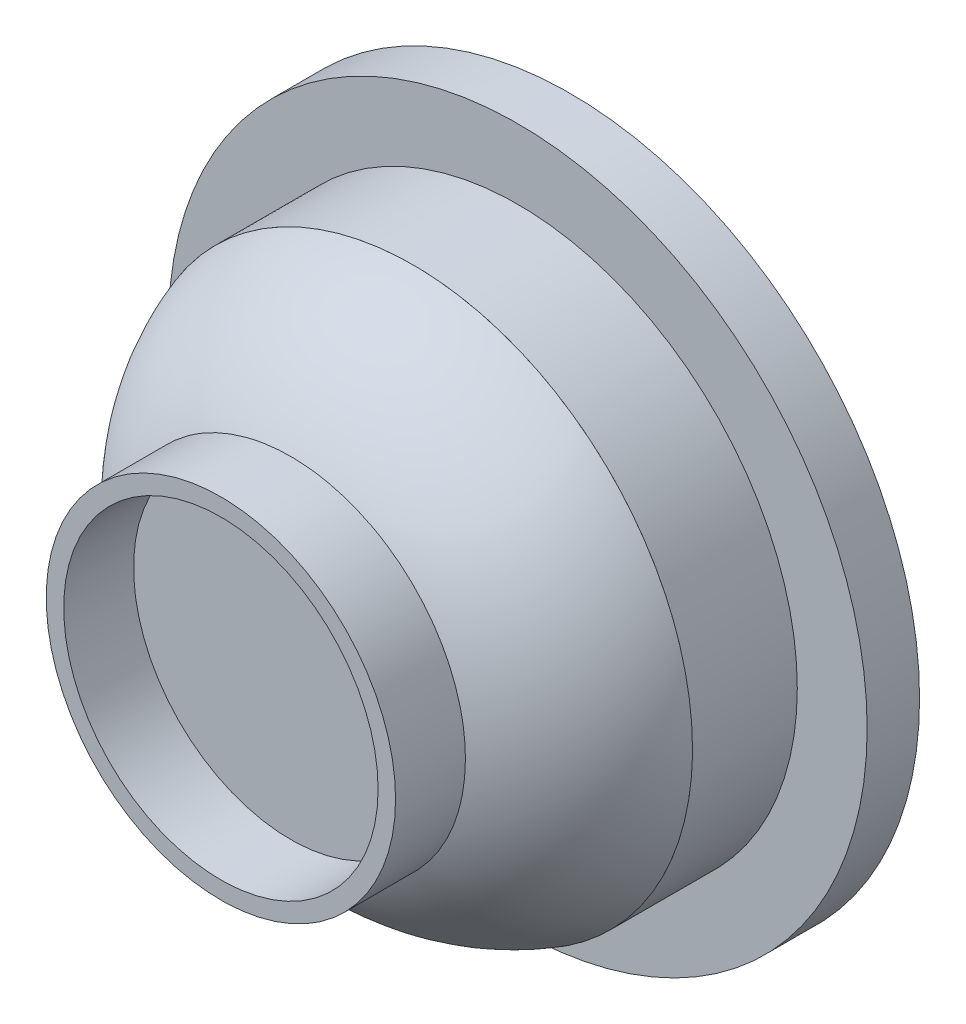
ISO-10303-21;
HEADER;
FILE_DESCRIPTION(('STEP AP214'),'2;1');
FILE_NAME('part.step','',(''),(''),'','','');
FILE_SCHEMA(('AUTOMOTIVE_DESIGN { 1 0 10303 214 1 1 1 1 }'));
ENDSEC;
DATA;
#1=APPLICATION_CONTEXT('core data for automotive mechanical design processes');
#2=APPLICATION_PROTOCOL_DEFINITION('international standard','automotive_design',2000,#1);
#3=PRODUCT_CONTEXT('',#1,'mechanical');
#4=PRODUCT('Part','Part','',(#3));
#5=PRODUCT_RELATED_PRODUCT_CATEGORY('part','',(#4));
#6=PRODUCT_DEFINITION_FORMATION('','',#4);
#7=PRODUCT_DEFINITION_CONTEXT('part definition',#1,'design');
#8=PRODUCT_DEFINITION('design','',#6,#7);
#9=PRODUCT_DEFINITION_SHAPE('','',#8);
#10=(LENGTH_UNIT() NAMED_UNIT(*) SI_UNIT(.MILLI.,.METRE.));
#11=(NAMED_UNIT(*) PLANE_ANGLE_UNIT() SI_UNIT($,.RADIAN.));
#12=(NAMED_UNIT(*) SI_UNIT($,.STERADIAN.) SOLID_ANGLE_UNIT());
#13=UNCERTAINTY_MEASURE_WITH_UNIT(LENGTH_MEASURE(1.E-05),#10,'distance_accuracy_value','');
#14=(GEOMETRIC_REPRESENTATION_CONTEXT(3) GLOBAL_UNCERTAINTY_ASSIGNED_CONTEXT((#13)) GLOBAL_UNIT_ASSIGNED_CONTEXT((#10,
#11,#12)) REPRESENTATION_CONTEXT('',''));
#15=CARTESIAN_POINT('',(0.,0.,0.));
#16=DIRECTION('',(0.,0.,1.));
#17=DIRECTION('',(1.,0.,0.));
#18=AXIS2_PLACEMENT_3D('',#15,#16,#17);
#19=CARTESIAN_POINT('',(0.,0.,45.));
#20=DIRECTION('',(0.,0.,1.));
#21=DIRECTION('',(1.,0.,0.));
#22=AXIS2_PLACEMENT_3D('',#19,#20,#21);
#23=PLANE('',#22);
#24=CARTESIAN_POINT('',(80.,0.,45.));
#25=CARTESIAN_POINT('',(80.,10.4719755119697,45.));
#26=CARTESIAN_POINT('',(77.9178141334707,20.9398307490025,45.));
#27=CARTESIAN_POINT('',(69.9029110683352,40.2895184294119,45.));
#28=CARTESIAN_POINT('',(63.9733473915511,49.1637375982602,45.));
#29=CARTESIAN_POINT('',(49.1637375982966,63.9733473915874,45.));
#30=CARTESIAN_POINT('',(40.2895184294911,69.9029110683901,45.));
#31=CARTESIAN_POINT('',(20.9398307489231,77.9178141334158,45.));
#32=CARTESIAN_POINT('',(10.4719755116933,80.,45.));
#33=CARTESIAN_POINT('',(-10.4719755116933,80.,45.));
#34=CARTESIAN_POINT('',(-20.939830749014,77.9178141332705,45.));
#35=CARTESIAN_POINT('',(-40.2895184294004,69.9029110685354,45.));
#36=CARTESIAN_POINT('',(-49.1637375982239,63.9733473916237,45.));
#37=CARTESIAN_POINT('',(-63.9733473916238,49.1637375982238,45.));
#38=CARTESIAN_POINT('',(-69.90291106839,40.2895184293641,45.));
#39=CARTESIAN_POINT('',(-77.9178141334158,20.9398307490504,45.));
#40=CARTESIAN_POINT('',(-80.,10.4719755116933,45.));
#41=CARTESIAN_POINT('',(-80.,-10.4719755116933,45.));
#42=CARTESIAN_POINT('',(-77.9178141334158,-20.9398307489957,45.));
#43=CARTESIAN_POINT('',(-69.9029110683901,-40.2895184294184,45.));
#44=CARTESIAN_POINT('',(-63.9733473916963,-49.1637375981149,45.));
#45=CARTESIAN_POINT('',(-49.1637375981512,-63.9733473917327,45.));
#46=CARTESIAN_POINT('',(-40.2895184293656,-69.9029110684597,45.));
#47=CARTESIAN_POINT('',(-20.939830749049,-77.917814133346,45.));
#48=CARTESIAN_POINT('',(-10.4719755116932,-79.9999999999274,45.));
#49=CARTESIAN_POINT('',(10.4719755116934,-80.0000000000727,45.));
#50=CARTESIAN_POINT('',(20.9398307490488,-77.9178141333461,45.));
#51=CARTESIAN_POINT('',(40.2895184293653,-69.9029110684598,45.));
#52=CARTESIAN_POINT('',(49.1637375984142,-63.9733473914335,45.));
#53=CARTESIAN_POINT('',(63.9733473914331,-49.1637375984145,45.));
#54=CARTESIAN_POINT('',(69.9029110683144,-40.2895184294201,45.));
#55=CARTESIAN_POINT('',(77.9178141334914,-20.9398307489945,45.));
#56=CARTESIAN_POINT('',(80.,-10.4719755119697,45.));
#57=CARTESIAN_POINT('',(80.,0.,45.));
#58=(BOUNDED_CURVE() B_SPLINE_CURVE(3,(#24,#25,#26,#27,#28,#29,#30,#31,#32,#33,#34,#35,#36,#37,
#38,#39,#40,#41,#42,#43,#44,#45,#46,#47,#48,#49,#50,#51,#52,#53,#54,#55,#56,#57),.UNSPECIFIED.,
.T.,.F.) B_SPLINE_CURVE_WITH_KNOTS((4,2,2,2,2,2,2,2,2,2,2,2,2,2,2,2,4),(0.,0.392699081698724,
0.785398163397448,1.17809724509617,1.5707963267949,1.96349540849362,2.35619449019234,
2.74889357189107,3.14159265358979,3.53429173528852,3.92699081698724,4.31968989868597,
4.71238898038469,5.10508806208341,5.49778714378214,5.89048622548086,6.28318530717959),
.UNSPECIFIED.) CURVE() GEOMETRIC_REPRESENTATION_ITEM() RATIONAL_B_SPLINE_CURVE((1.,1.,1.,1.,1.,
1.,1.,1.,1.,1.,1.,1.,1.,1.,1.,1.,1.,1.,1.,1.,1.,1.,1.,1.,1.,1.,1.,1.,1.,1.,1.,1.,1.,1.)) REPRESENTATION_ITEM(''));
#59=CARTESIAN_POINT('',(80.,0.,45.));
#60=VERTEX_POINT('',#59);
#61=EDGE_CURVE('E69',#60,#60,#58,.T.);
#62=ORIENTED_EDGE('',*,*,#61,.F.);
#63=EDGE_LOOP('',(#62));
#64=FACE_BOUND('',#63,.T.);
#65=ADVANCED_FACE('F56',(#64),#23,.F.);
#66=CARTESIAN_POINT('',(0.,0.,100.));
#67=DIRECTION('',(0.,0.,1.));
#68=DIRECTION('',(1.,0.,0.));
#69=AXIS2_PLACEMENT_3D('',#66,#67,#68);
#70=PLANE('',#69);
#71=CARTESIAN_POINT('',(0.,0.,100.));
#72=DIRECTION('',(0.,0.,1.));
#73=DIRECTION('',(1.,0.,0.));
#74=AXIS2_PLACEMENT_3D('',#71,#72,#73);
#75=CIRCLE('',#74,50.);
#76=CARTESIAN_POINT('',(50.,0.,100.));
#77=VERTEX_POINT('',#76);
#78=EDGE_CURVE('E74',#77,#77,#75,.T.);
#79=ORIENTED_EDGE('',*,*,#78,.T.);
#80=EDGE_LOOP('',(#79));
#81=FACE_BOUND('',#80,.T.);
#82=CARTESIAN_POINT('',(0.,0.,100.));
#83=DIRECTION('',(0.,0.,1.));
#84=DIRECTION('',(1.,0.,0.));
#85=AXIS2_PLACEMENT_3D('',#82,#83,#84);
#86=CIRCLE('',#85,45.);
#87=CARTESIAN_POINT('',(45.,0.,100.));
#88=VERTEX_POINT('',#87);
#89=EDGE_CURVE('E139',#88,#88,#86,.T.);
#90=ORIENTED_EDGE('',*,*,#89,.F.);
#91=EDGE_LOOP('',(#90));
#92=FACE_BOUND('',#91,.T.);
#93=ADVANCED_FACE('F118',(#81,#92),#70,.T.);
#94=CARTESIAN_POINT('',(0.,0.,100.));
#95=DIRECTION('',(0.,0.,-1.));
#96=DIRECTION('',(-1.,0.,0.));
#97=AXIS2_PLACEMENT_3D('',#94,#95,#96);
#98=CYLINDRICAL_SURFACE('',#97,50.);
#99=ORIENTED_EDGE('',*,*,#78,.F.);
#100=EDGE_LOOP('',(#99));
#101=FACE_BOUND('',#100,.T.);
#102=CARTESIAN_POINT('',(50.,0.,80.));
#103=CARTESIAN_POINT('',(50.,-6.54498469498106,80.));
#104=CARTESIAN_POINT('',(48.6986338333685,-13.0873942180966,80.0000000001453));
#105=CARTESIAN_POINT('',(43.6893194177601,-25.1809490184125,79.9999999998547));
#106=CARTESIAN_POINT('',(39.9833421196639,-30.7273359989909,80.0000000001453));
#107=CARTESIAN_POINT('',(30.7273359989907,-39.9833421196641,79.9999999998547));
#108=CARTESIAN_POINT('',(25.1809490183579,-43.6893194178328,80.));
#109=CARTESIAN_POINT('',(13.0873942181509,-48.6986338332959,80.));
#110=CARTESIAN_POINT('',(6.54498469480838,-49.9999999999637,79.9999999999273));
#111=CARTESIAN_POINT('',(-6.54498469480822,-50.0000000000363,80.0000000000726));
#112=CARTESIAN_POINT('',(-13.0873942181511,-48.6986338334049,80.));
#113=CARTESIAN_POINT('',(-25.180949018358,-43.6893194177238,80.));
#114=CARTESIAN_POINT('',(-30.727335998899,-39.9833421197921,80.));
#115=CARTESIAN_POINT('',(-39.9833421197557,-30.7273359988627,80.));
#116=CARTESIAN_POINT('',(-43.6893194177075,-25.1809490184092,80.));
#117=CARTESIAN_POINT('',(-48.6986338334212,-13.0873942180996,80.));
#118=CARTESIAN_POINT('',(-50.,-6.54498469480829,80.));
#119=CARTESIAN_POINT('',(-50.,6.5449846948083,80.));
#120=CARTESIAN_POINT('',(-48.6986338333485,13.0873942181361,80.));
#121=CARTESIAN_POINT('',(-43.6893194177801,25.180949018373,80.));
#122=CARTESIAN_POINT('',(-39.9833421197558,30.727335998899,79.9999999999273));
#123=CARTESIAN_POINT('',(-30.727335998899,39.9833421197557,80.0000000000727));
#124=CARTESIAN_POINT('',(-25.1809490184093,43.6893194178165,80.));
#125=CARTESIAN_POINT('',(-13.0873942180997,48.6986338333122,80.));
#126=CARTESIAN_POINT('',(-6.54498469480829,50.,80.));
#127=CARTESIAN_POINT('',(6.54498469480829,50.,80.));
#128=CARTESIAN_POINT('',(13.0873942180633,48.6986338333486,80.0000000001453));
#129=CARTESIAN_POINT('',(25.1809490184456,43.6893194177801,79.9999999998547));
#130=CARTESIAN_POINT('',(30.7273359988627,39.9833421197557,80.0000000000726));
#131=CARTESIAN_POINT('',(39.9833421197921,30.727335998899,79.9999999999273));
#132=CARTESIAN_POINT('',(43.6893194177913,25.1809490184188,79.9999999999274));
#133=CARTESIAN_POINT('',(48.6986338333374,13.0873942180902,80.0000000000727));
#134=CARTESIAN_POINT('',(50.,6.54498469498105,80.));
#135=CARTESIAN_POINT('',(50.,0.,80.));
#136=(BOUNDED_CURVE() B_SPLINE_CURVE(3,(#102,#103,#104,#105,#106,#107,#108,#109,#110,#111,#112,
#113,#114,#115,#116,#117,#118,#119,#120,#121,#122,#123,#124,#125,#126,#127,#128,#129,#130,#131,
#132,#133,#134,#135),.UNSPECIFIED.,.T.,.F.) B_SPLINE_CURVE_WITH_KNOTS((4,2,2,2,2,2,2,2,2,2,2,2,
2,2,2,2,4),(0.,0.392699081698725,0.785398163397448,1.17809724509617,1.5707963267949,
1.96349540849362,2.35619449019234,2.74889357189107,3.14159265358979,3.53429173528852,
3.92699081698724,4.31968989868597,4.71238898038469,5.10508806208341,5.49778714378214,
5.89048622548086,6.28318530717959),
.UNSPECIFIED.) CURVE() GEOMETRIC_REPRESENTATION_ITEM() RATIONAL_B_SPLINE_CURVE((1.,1.,1.,1.,1.,
1.,1.,1.,1.,1.,1.,1.,1.,1.,1.,1.,1.,1.,1.,1.,1.,1.,1.,1.,1.,1.,1.,1.,1.,1.,1.,1.,1.,1.)) REPRESENTATION_ITEM(''));
#137=CARTESIAN_POINT('',(50.,0.,80.));
#138=VERTEX_POINT('',#137);
#139=EDGE_CURVE('E82',#138,#138,#136,.F.);
#140=ORIENTED_EDGE('',*,*,#139,.T.);
#141=EDGE_LOOP('',(#140));
#142=FACE_BOUND('',#141,.T.);
#143=ADVANCED_FACE('F107',(#101,#142),#98,.T.);
#144=CARTESIAN_POINT('',(0.,0.,100.));
#145=DIRECTION('',(0.,0.,-1.));
#146=DIRECTION('',(-1.,0.,0.));
#147=AXIS2_PLACEMENT_3D('',#144,#145,#146);
#148=CYLINDRICAL_SURFACE('',#147,45.);
#149=ORIENTED_EDGE('',*,*,#89,.T.);
#150=EDGE_LOOP('',(#149));
#151=FACE_BOUND('',#150,.T.);
#152=CARTESIAN_POINT('',(0.,0.,80.));
#153=DIRECTION('',(0.,0.,1.));
#154=DIRECTION('',(1.,0.,0.));
#155=AXIS2_PLACEMENT_3D('',#152,#153,#154);
#156=CIRCLE('',#155,45.);
#157=CARTESIAN_POINT('',(45.,0.,80.));
#158=VERTEX_POINT('',#157);
#159=EDGE_CURVE('E12',#158,#158,#156,.F.);
#160=ORIENTED_EDGE('',*,*,#159,.T.);
#161=EDGE_LOOP('',(#160));
#162=FACE_BOUND('',#161,.T.);
#163=ADVANCED_FACE('F117',(#151,#162),#148,.F.);
#164=CARTESIAN_POINT('',(0.,0.,80.));
#165=DIRECTION('',(0.,0.,1.));
#166=DIRECTION('',(1.,0.,0.));
#167=AXIS2_PLACEMENT_3D('',#164,#165,#166);
#168=PLANE('',#167);
#169=ORIENTED_EDGE('',*,*,#159,.F.);
#170=EDGE_LOOP('',(#169));
#171=FACE_BOUND('',#170,.T.);
#172=ADVANCED_FACE('F121',(#171),#168,.T.);
#173=CARTESIAN_POINT('',(50.,0.,80.));
#174=CARTESIAN_POINT('',(50.,6.54498469498105,80.));
#175=CARTESIAN_POINT('',(48.6986338333374,13.0873942180902,80.0000000000727));
#176=CARTESIAN_POINT('',(43.6893194177913,25.1809490184188,79.9999999999274));
#177=CARTESIAN_POINT('',(39.9833421197921,30.727335998899,79.9999999999273));
#178=CARTESIAN_POINT('',(30.7273359988627,39.9833421197557,80.0000000000726));
#179=CARTESIAN_POINT('',(25.1809490184456,43.6893194177801,79.9999999998547));
#180=CARTESIAN_POINT('',(13.0873942180633,48.6986338333486,80.0000000001453));
#181=CARTESIAN_POINT('',(6.54498469480829,50.,80.));
#182=CARTESIAN_POINT('',(-6.54498469480829,50.,80.));
#183=CARTESIAN_POINT('',(-13.0873942180997,48.6986338333122,80.));
#184=CARTESIAN_POINT('',(-25.1809490184093,43.6893194178165,80.));
#185=CARTESIAN_POINT('',(-30.727335998899,39.9833421197557,80.0000000000727));
#186=CARTESIAN_POINT('',(-39.9833421197558,30.727335998899,79.9999999999273));
#187=CARTESIAN_POINT('',(-43.6893194177801,25.180949018373,80.));
#188=CARTESIAN_POINT('',(-48.6986338333485,13.0873942181361,80.));
#189=CARTESIAN_POINT('',(-50.,6.5449846948083,80.));
#190=CARTESIAN_POINT('',(-50.,-6.54498469480829,80.));
#191=CARTESIAN_POINT('',(-48.6986338334212,-13.0873942180996,80.));
#192=CARTESIAN_POINT('',(-43.6893194177075,-25.1809490184092,80.));
#193=CARTESIAN_POINT('',(-39.9833421197557,-30.7273359988627,80.));
#194=CARTESIAN_POINT('',(-30.727335998899,-39.9833421197921,80.));
#195=CARTESIAN_POINT('',(-25.180949018358,-43.6893194177238,80.));
#196=CARTESIAN_POINT('',(-13.0873942181511,-48.6986338334049,80.));
#197=CARTESIAN_POINT('',(-6.54498469480822,-50.0000000000363,80.0000000000726));
#198=CARTESIAN_POINT('',(6.54498469480838,-49.9999999999637,79.9999999999273));
#199=CARTESIAN_POINT('',(13.0873942181509,-48.6986338332959,80.));
#200=CARTESIAN_POINT('',(25.1809490183579,-43.6893194178328,80.));
#201=CARTESIAN_POINT('',(30.7273359989907,-39.9833421196641,79.9999999998547));
#202=CARTESIAN_POINT('',(39.9833421196639,-30.7273359989909,80.0000000001453));
#203=CARTESIAN_POINT('',(43.6893194177601,-25.1809490184125,79.9999999998547));
#204=CARTESIAN_POINT('',(48.6986338333685,-13.0873942180966,80.0000000001453));
#205=CARTESIAN_POINT('',(50.,-6.54498469498106,80.));
#206=CARTESIAN_POINT('',(50.,0.,80.));
#207=CARTESIAN_POINT('',(72.2812637944242,0.,68.7410832523635));
#208=CARTESIAN_POINT('',(72.2812637944242,9.46159530536788,68.7410832523635));
#209=CARTESIAN_POINT('',(70.3999759708215,18.9194678772331,68.7410832525089));
#210=CARTESIAN_POINT('',(63.1583844366136,36.4022163718403,68.7410832522183));
#211=CARTESIAN_POINT('',(57.8009299828034,44.4202135807386,68.7410832523635));
#212=CARTESIAN_POINT('',(44.4202135807386,57.8009299828034,68.7410832523635));
#213=CARTESIAN_POINT('',(36.4022163719699,63.1583844368155,68.7410832521456));
#214=CARTESIAN_POINT('',(18.9194678771034,70.3999759706197,68.7410832525815));
#215=CARTESIAN_POINT('',(9.46159530511814,72.2812637944242,68.7410832523635));
#216=CARTESIAN_POINT('',(-9.46159530511813,72.2812637944242,68.7410832523635));
#217=CARTESIAN_POINT('',(-18.9194678772307,70.3999759706923,68.7410832524362));
#218=CARTESIAN_POINT('',(-36.4022163718428,63.1583844367428,68.7410832522909));
#219=CARTESIAN_POINT('',(-44.4202135805933,57.8009299827307,68.7410832525089));
#220=CARTESIAN_POINT('',(-57.8009299829487,44.4202135808113,68.7410832522182));
#221=CARTESIAN_POINT('',(-63.1583844366701,36.4022163717884,68.7410832522182));
#222=CARTESIAN_POINT('',(-70.3999759707649,18.9194678772852,68.7410832525089));
#223=CARTESIAN_POINT('',(-72.2812637944242,9.46159530511814,68.7410832523635));
#224=CARTESIAN_POINT('',(-72.2812637944242,-9.46159530511813,68.7410832523635));
#225=CARTESIAN_POINT('',(-70.3999759708377,-18.9194678772123,68.7410832522182));
#226=CARTESIAN_POINT('',(-63.1583844365976,-36.4022163718609,68.7410832525089));
#227=CARTESIAN_POINT('',(-57.800929982767,-44.420213580557,68.7410832523636));
#228=CARTESIAN_POINT('',(-44.4202135807749,-57.8009299829851,68.7410832523636));
#229=CARTESIAN_POINT('',(-36.4022163717867,-63.1583844366534,68.7410832524362));
#230=CARTESIAN_POINT('',(-18.9194678772869,-70.3999759707816,68.7410832522909));
#231=CARTESIAN_POINT('',(-9.46159530511803,-72.2812637942788,68.7410832523635));
#232=CARTESIAN_POINT('',(9.46159530511826,-72.2812637945695,68.7410832523635));
#233=CARTESIAN_POINT('',(18.9194678773049,-70.3999759707817,68.7410832521455));
#234=CARTESIAN_POINT('',(36.4022163717683,-63.1583844366535,68.7410832525815));
#235=CARTESIAN_POINT('',(44.4202135809035,-57.8009299827111,68.7410832521456));
#236=CARTESIAN_POINT('',(57.8009299826382,-44.4202135808311,68.7410832525816));
#237=CARTESIAN_POINT('',(63.1583844367988,-36.4022163718775,68.7410832522182));
#238=CARTESIAN_POINT('',(70.3999759706363,-18.9194678771961,68.7410832525088));
#239=CARTESIAN_POINT('',(72.2812637944242,-9.46159530536789,68.7410832523635));
#240=CARTESIAN_POINT('',(72.2812637944242,0.,68.7410832523635));
#241=CARTESIAN_POINT('',(80.,0.,45.));
#242=CARTESIAN_POINT('',(80.,10.4719755119697,45.));
#243=CARTESIAN_POINT('',(77.9178141334707,20.9398307490025,45.));
#244=CARTESIAN_POINT('',(69.9029110683352,40.2895184294119,45.));
#245=CARTESIAN_POINT('',(63.9733473915511,49.1637375982602,45.));
#246=CARTESIAN_POINT('',(49.1637375982966,63.9733473915874,45.));
#247=CARTESIAN_POINT('',(40.2895184294911,69.9029110683901,45.));
#248=CARTESIAN_POINT('',(20.9398307489231,77.9178141334158,45.));
#249=CARTESIAN_POINT('',(10.4719755116933,80.,45.));
#250=CARTESIAN_POINT('',(-10.4719755116933,80.,45.));
#251=CARTESIAN_POINT('',(-20.939830749014,77.9178141332705,45.));
#252=CARTESIAN_POINT('',(-40.2895184294004,69.9029110685354,45.));
#253=CARTESIAN_POINT('',(-49.1637375982239,63.9733473916237,45.));
#254=CARTESIAN_POINT('',(-63.9733473916238,49.1637375982238,45.));
#255=CARTESIAN_POINT('',(-69.90291106839,40.2895184293641,45.));
#256=CARTESIAN_POINT('',(-77.9178141334158,20.9398307490504,45.));
#257=CARTESIAN_POINT('',(-80.,10.4719755116933,45.));
#258=CARTESIAN_POINT('',(-80.,-10.4719755116933,45.));
#259=CARTESIAN_POINT('',(-77.9178141334158,-20.9398307489957,45.));
#260=CARTESIAN_POINT('',(-69.9029110683901,-40.2895184294184,45.));
#261=CARTESIAN_POINT('',(-63.9733473916963,-49.1637375981149,45.));
#262=CARTESIAN_POINT('',(-49.1637375981512,-63.9733473917327,45.));
#263=CARTESIAN_POINT('',(-40.2895184293656,-69.9029110684597,45.));
#264=CARTESIAN_POINT('',(-20.939830749049,-77.917814133346,45.));
#265=CARTESIAN_POINT('',(-10.4719755116932,-79.9999999999274,45.));
#266=CARTESIAN_POINT('',(10.4719755116934,-80.0000000000727,45.));
#267=CARTESIAN_POINT('',(20.9398307490488,-77.9178141333461,45.));
#268=CARTESIAN_POINT('',(40.2895184293653,-69.9029110684598,45.));
#269=CARTESIAN_POINT('',(49.1637375984142,-63.9733473914335,45.));
#270=CARTESIAN_POINT('',(63.9733473914331,-49.1637375984145,45.));
#271=CARTESIAN_POINT('',(69.9029110683144,-40.2895184294201,45.));
#272=CARTESIAN_POINT('',(77.9178141334914,-20.9398307489945,45.));
#273=CARTESIAN_POINT('',(80.,-10.4719755119697,45.));
#274=CARTESIAN_POINT('',(80.,0.,45.));
#275=(BOUNDED_SURFACE() B_SPLINE_SURFACE(2,3,((#173,#174,#175,#176,#177,#178,#179,#180,#181,
#182,#183,#184,#185,#186,#187,#188,#189,#190,#191,#192,#193,#194,#195,#196,#197,#198,#199,#200,
#201,#202,#203,#204,#205,#206),(#207,#208,#209,#210,#211,#212,#213,#214,#215,#216,#217,#218,
#219,#220,#221,#222,#223,#224,#225,#226,#227,#228,#229,#230,#231,#232,#233,#234,#235,#236,#237,
#238,#239,#240),(#241,#242,#243,#244,#245,#246,#247,#248,#249,#250,#251,#252,#253,#254,#255,
#256,#257,#258,#259,#260,#261,#262,#263,#264,#265,#266,#267,#268,#269,#270,#271,#272,#273,
#274)),.UNSPECIFIED.,.F.,.T.,.F.) B_SPLINE_SURFACE_WITH_KNOTS((3,3),(4,2,2,2,2,2,2,2,2,2,2,2,2,
2,2,2,4),(0.,1.),(0.,0.392699081698724,0.785398163397448,1.17809724509617,1.5707963267949,
1.96349540849362,2.35619449019234,2.74889357189107,3.14159265358979,3.53429173528852,
3.92699081698724,4.31968989868597,4.71238898038469,5.10508806208341,5.49778714378214,
5.89048622548086,6.28318530717959),
.UNSPECIFIED.) GEOMETRIC_REPRESENTATION_ITEM() RATIONAL_B_SPLINE_SURFACE(((1.,1.,1.,1.,1.,1.,1.,
1.,1.,1.,1.,1.,1.,1.,1.,1.,1.,1.,1.,1.,1.,1.,1.,1.,1.,1.,1.,1.,1.,1.,1.,1.,1.,1.),
(0.923271658590014,0.923271658590014,0.923271658590014,0.923271658590014,0.923271658590014,
0.923271658590014,0.923271658590014,0.923271658590014,0.923271658590014,0.923271658590014,
0.923271658590014,0.923271658590014,0.923271658590014,0.923271658590014,0.923271658590014,
0.923271658590014,0.923271658590014,0.923271658590014,0.923271658590014,0.923271658590014,
0.923271658590014,0.923271658590014,0.923271658590014,0.923271658590014,0.923271658590014,
0.923271658590014,0.923271658590014,0.923271658590014,0.923271658590014,0.923271658590014,
0.923271658590014,0.923271658590014,0.923271658590014,0.923271658590014),(1.,1.,1.,1.,1.,1.,1.,
1.,1.,1.,1.,1.,1.,1.,1.,1.,1.,1.,1.,1.,1.,1.,1.,1.,1.,1.,1.,1.,1.,1.,1.,1.,1.,1.))) REPRESENTATION_ITEM('') SURFACE());
#276=ORIENTED_EDGE('',*,*,#61,.T.);
#277=EDGE_LOOP('',(#276));
#278=FACE_BOUND('',#277,.T.);
#279=ORIENTED_EDGE('',*,*,#139,.F.);
#280=EDGE_LOOP('',(#279));
#281=FACE_BOUND('',#280,.T.);
#282=ADVANCED_FACE('F59',(#278,#281),#275,.T.);
#283=CLOSED_SHELL('',(#65,#93,#143,#163,#172,#282));
#284=MANIFOLD_SOLID_BREP('B2',#283);
#285=CARTESIAN_POINT('',(0.,0.,15.));
#286=DIRECTION('',(0.,0.,-1.));
#287=DIRECTION('',(-1.,0.,0.));
#288=AXIS2_PLACEMENT_3D('',#285,#286,#287);
#289=CYLINDRICAL_SURFACE('',#288,100.);
#290=CARTESIAN_POINT('',(0.,0.,15.));
#291=DIRECTION('',(0.,0.,1.));
#292=DIRECTION('',(1.,0.,0.));
#293=AXIS2_PLACEMENT_3D('',#290,#291,#292);
#294=CIRCLE('',#293,100.);
#295=CARTESIAN_POINT('',(100.,0.,15.));
#296=VERTEX_POINT('',#295);
#297=EDGE_CURVE('E213',#296,#296,#294,.T.);
#298=ORIENTED_EDGE('',*,*,#297,.F.);
#299=EDGE_LOOP('',(#298));
#300=FACE_BOUND('',#299,.T.);
#301=CARTESIAN_POINT('',(0.,0.,0.));
#302=DIRECTION('',(0.,0.,1.));
#303=DIRECTION('',(1.,0.,0.));
#304=AXIS2_PLACEMENT_3D('',#301,#302,#303);
#305=CIRCLE('',#304,100.);
#306=CARTESIAN_POINT('',(100.,0.,0.));
#307=VERTEX_POINT('',#306);
#308=EDGE_CURVE('E209',#307,#307,#305,.T.);
#309=ORIENTED_EDGE('',*,*,#308,.T.);
#310=EDGE_LOOP('',(#309));
#311=FACE_BOUND('',#310,.T.);
#312=ADVANCED_FACE('F206',(#300,#311),#289,.T.);
#313=CARTESIAN_POINT('',(0.,0.,15.));
#314=DIRECTION('',(0.,0.,1.));
#315=DIRECTION('',(1.,0.,0.));
#316=AXIS2_PLACEMENT_3D('',#313,#314,#315);
#317=PLANE('',#316);
#318=CARTESIAN_POINT('',(0.,0.,15.));
#319=DIRECTION('',(0.,0.,1.));
#320=DIRECTION('',(1.,0.,0.));
#321=AXIS2_PLACEMENT_3D('',#318,#319,#320);
#322=CIRCLE('',#321,80.);
#323=CARTESIAN_POINT('',(80.,0.,15.));
#324=VERTEX_POINT('',#323);
#325=EDGE_CURVE('E55',#324,#324,#322,.T.);
#326=ORIENTED_EDGE('',*,*,#325,.F.);
#327=EDGE_LOOP('',(#326));
#328=FACE_BOUND('',#327,.T.);
#329=ORIENTED_EDGE('',*,*,#297,.T.);
#330=EDGE_LOOP('',(#329));
#331=FACE_BOUND('',#330,.T.);
#332=ADVANCED_FACE('F230',(#328,#331),#317,.T.);
#333=CARTESIAN_POINT('',(0.,0.,0.));
#334=DIRECTION('',(0.,0.,1.));
#335=DIRECTION('',(1.,0.,0.));
#336=AXIS2_PLACEMENT_3D('',#333,#334,#335);
#337=PLANE('',#336);
#338=ORIENTED_EDGE('',*,*,#308,.F.);
#339=EDGE_LOOP('',(#338));
#340=FACE_BOUND('',#339,.T.);
#341=ADVANCED_FACE('F227',(#340),#337,.F.);
#342=CARTESIAN_POINT('',(0.,0.,45.));
#343=DIRECTION('',(0.,0.,-1.));
#344=DIRECTION('',(-1.,0.,0.));
#345=AXIS2_PLACEMENT_3D('',#342,#343,#344);
#346=CYLINDRICAL_SURFACE('',#345,80.);
#347=CARTESIAN_POINT('',(0.,0.,45.));
#348=DIRECTION('',(0.,0.,1.));
#349=DIRECTION('',(1.,0.,0.));
#350=AXIS2_PLACEMENT_3D('',#347,#348,#349);
#351=CIRCLE('',#350,80.);
#352=CARTESIAN_POINT('',(80.,0.,45.));
#353=VERTEX_POINT('',#352);
#354=EDGE_CURVE('E219',#353,#353,#351,.T.);
#355=ORIENTED_EDGE('',*,*,#354,.F.);
#356=EDGE_LOOP('',(#355));
#357=FACE_BOUND('',#356,.T.);
#358=ORIENTED_EDGE('',*,*,#325,.T.);
#359=EDGE_LOOP('',(#358));
#360=FACE_BOUND('',#359,.T.);
#361=ADVANCED_FACE('F229',(#357,#360),#346,.T.);
#362=CARTESIAN_POINT('',(0.,0.,45.));
#363=DIRECTION('',(0.,0.,1.));
#364=DIRECTION('',(1.,0.,0.));
#365=AXIS2_PLACEMENT_3D('',#362,#363,#364);
#366=PLANE('',#365);
#367=ORIENTED_EDGE('',*,*,#354,.T.);
#368=EDGE_LOOP('',(#367));
#369=FACE_BOUND('',#368,.T.);
#370=ADVANCED_FACE('F236',(#369),#366,.T.);
#371=CLOSED_SHELL('',(#312,#332,#341,#361,#370));
#372=MANIFOLD_SOLID_BREP('B7',#371);
#373=ADVANCED_BREP_SHAPE_REPRESENTATION('',(#18,#284,#372),#14);
#374=SHAPE_DEFINITION_REPRESENTATION(#9,#373);
ENDSEC;
END-ISO-10303-21;
